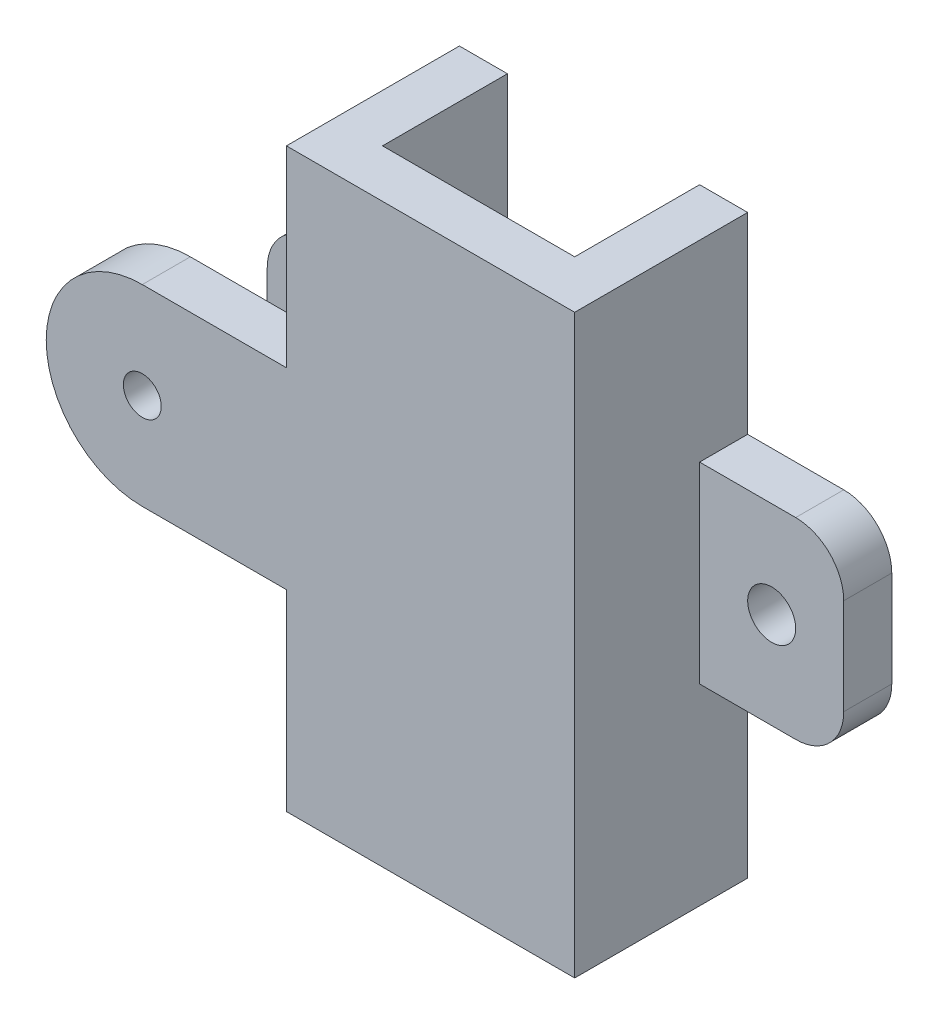
ISO-10303-21;
HEADER;
FILE_DESCRIPTION(('STEP AP214'),'2;1');
FILE_NAME('part.step','',(''),(''),'','','');
FILE_SCHEMA(('AUTOMOTIVE_DESIGN { 1 0 10303 214 1 1 1 1 }'));
ENDSEC;
DATA;
#1=APPLICATION_CONTEXT('core data for automotive mechanical design processes');
#2=APPLICATION_PROTOCOL_DEFINITION('international standard','automotive_design',2000,#1);
#3=PRODUCT_CONTEXT('',#1,'mechanical');
#4=PRODUCT('Part','Part','',(#3));
#5=PRODUCT_RELATED_PRODUCT_CATEGORY('part','',(#4));
#6=PRODUCT_DEFINITION_FORMATION('','',#4);
#7=PRODUCT_DEFINITION_CONTEXT('part definition',#1,'design');
#8=PRODUCT_DEFINITION('design','',#6,#7);
#9=PRODUCT_DEFINITION_SHAPE('','',#8);
#10=(LENGTH_UNIT() NAMED_UNIT(*) SI_UNIT(.MILLI.,.METRE.));
#11=(NAMED_UNIT(*) PLANE_ANGLE_UNIT() SI_UNIT($,.RADIAN.));
#12=(NAMED_UNIT(*) SI_UNIT($,.STERADIAN.) SOLID_ANGLE_UNIT());
#13=UNCERTAINTY_MEASURE_WITH_UNIT(LENGTH_MEASURE(1.E-05),#10,'distance_accuracy_value','');
#14=(GEOMETRIC_REPRESENTATION_CONTEXT(3) GLOBAL_UNCERTAINTY_ASSIGNED_CONTEXT((#13)) GLOBAL_UNIT_ASSIGNED_CONTEXT((#10,
#11,#12)) REPRESENTATION_CONTEXT('',''));
#15=CARTESIAN_POINT('',(0.,0.,0.));
#16=DIRECTION('',(0.,0.,1.));
#17=DIRECTION('',(1.,0.,0.));
#18=AXIS2_PLACEMENT_3D('',#15,#16,#17);
#19=CARTESIAN_POINT('',(38.1,76.2,0.));
#20=DIRECTION('',(-1.,0.,0.));
#21=DIRECTION('',(0.,0.,1.));
#22=AXIS2_PLACEMENT_3D('',#19,#20,#21);
#23=PLANE('',#22);
#24=DIRECTION('',(0.,0.,-1.));
#25=VECTOR('',#24,1.);
#26=CARTESIAN_POINT('',(38.1,25.4,-16.51));
#27=LINE('',#26,#25);
#28=CARTESIAN_POINT('',(38.1,25.4,-16.51));
#29=VERTEX_POINT('',#28);
#30=CARTESIAN_POINT('',(38.1,25.4,-22.86));
#31=VERTEX_POINT('',#30);
#32=EDGE_CURVE('E290',#29,#31,#27,.T.);
#33=ORIENTED_EDGE('',*,*,#32,.F.);
#34=DIRECTION('',(0.,1.,0.));
#35=VECTOR('',#34,1.);
#36=CARTESIAN_POINT('',(38.1,50.8,-16.51));
#37=LINE('',#36,#35);
#38=CARTESIAN_POINT('',(38.1,50.8,-16.51));
#39=VERTEX_POINT('',#38);
#40=EDGE_CURVE('E264',#29,#39,#37,.T.);
#41=ORIENTED_EDGE('',*,*,#40,.T.);
#42=DIRECTION('',(0.,0.,-1.));
#43=VECTOR('',#42,1.);
#44=CARTESIAN_POINT('',(38.1,50.8,-16.51));
#45=LINE('',#44,#43);
#46=CARTESIAN_POINT('',(38.1,50.8,-22.86));
#47=VERTEX_POINT('',#46);
#48=EDGE_CURVE('E280',#39,#47,#45,.T.);
#49=ORIENTED_EDGE('',*,*,#48,.T.);
#50=DIRECTION('',(0.,-1.,0.));
#51=VECTOR('',#50,1.);
#52=CARTESIAN_POINT('',(38.1,76.2,-22.86));
#53=LINE('',#52,#51);
#54=CARTESIAN_POINT('',(38.1,76.2,-22.86));
#55=VERTEX_POINT('',#54);
#56=EDGE_CURVE('E393',#55,#47,#53,.T.);
#57=ORIENTED_EDGE('',*,*,#56,.F.);
#58=DIRECTION('',(0.,0.,-1.));
#59=VECTOR('',#58,1.);
#60=CARTESIAN_POINT('',(38.1,76.2,0.));
#61=LINE('',#60,#59);
#62=CARTESIAN_POINT('',(38.1,76.2,0.));
#63=VERTEX_POINT('',#62);
#64=EDGE_CURVE('E365',#63,#55,#61,.T.);
#65=ORIENTED_EDGE('',*,*,#64,.F.);
#66=DIRECTION('',(0.,-1.,0.));
#67=VECTOR('',#66,1.);
#68=CARTESIAN_POINT('',(38.1,76.2,0.));
#69=LINE('',#68,#67);
#70=CARTESIAN_POINT('',(38.1,0.,0.));
#71=VERTEX_POINT('',#70);
#72=EDGE_CURVE('E397',#63,#71,#69,.T.);
#73=ORIENTED_EDGE('',*,*,#72,.T.);
#74=DIRECTION('',(0.,0.,-1.));
#75=VECTOR('',#74,1.);
#76=CARTESIAN_POINT('',(38.1,0.,0.));
#77=LINE('',#76,#75);
#78=CARTESIAN_POINT('',(38.1,0.,-22.86));
#79=VERTEX_POINT('',#78);
#80=EDGE_CURVE('E346',#71,#79,#77,.T.);
#81=ORIENTED_EDGE('',*,*,#80,.T.);
#82=EDGE_CURVE('E368',#31,#79,#53,.T.);
#83=ORIENTED_EDGE('',*,*,#82,.F.);
#84=EDGE_LOOP('',(#33,#41,#49,#57,#65,#73,#81,#83));
#85=FACE_BOUND('',#84,.T.);
#86=ADVANCED_FACE('F41',(#85),#23,.F.);
#87=CARTESIAN_POINT('',(0.,76.2,-22.86));
#88=DIRECTION('',(0.,0.,-1.));
#89=DIRECTION('',(-1.,0.,0.));
#90=AXIS2_PLACEMENT_3D('',#87,#88,#89);
#91=PLANE('',#90);
#92=DIRECTION('',(0.,-1.,0.));
#93=VECTOR('',#92,1.);
#94=CARTESIAN_POINT('',(57.15,50.8,-22.86));
#95=LINE('',#94,#93);
#96=CARTESIAN_POINT('',(57.15,44.45,-22.86));
#97=VERTEX_POINT('',#96);
#98=CARTESIAN_POINT('',(57.15,31.75,-22.86));
#99=VERTEX_POINT('',#98);
#100=EDGE_CURVE('E284',#97,#99,#95,.T.);
#101=ORIENTED_EDGE('',*,*,#100,.T.);
#102=CARTESIAN_POINT('',(50.8,31.75,-22.86));
#103=DIRECTION('',(0.,0.,-1.));
#104=DIRECTION('',(-1.,0.,0.));
#105=AXIS2_PLACEMENT_3D('',#102,#103,#104);
#106=CIRCLE('',#105,6.35);
#107=CARTESIAN_POINT('',(50.8,25.4,-22.86));
#108=VERTEX_POINT('',#107);
#109=EDGE_CURVE('E432',#99,#108,#106,.T.);
#110=ORIENTED_EDGE('',*,*,#109,.T.);
#111=DIRECTION('',(-1.,0.,0.));
#112=VECTOR('',#111,1.);
#113=CARTESIAN_POINT('',(38.1,25.4,-22.86));
#114=LINE('',#113,#112);
#115=EDGE_CURVE('E269',#108,#31,#114,.T.);
#116=ORIENTED_EDGE('',*,*,#115,.T.);
#117=ORIENTED_EDGE('',*,*,#82,.T.);
#118=DIRECTION('',(1.,0.,0.));
#119=VECTOR('',#118,1.);
#120=CARTESIAN_POINT('',(0.,0.,-22.86));
#121=LINE('',#120,#119);
#122=CARTESIAN_POINT('',(31.75,0.,-22.86));
#123=VERTEX_POINT('',#122);
#124=EDGE_CURVE('E340',#123,#79,#121,.T.);
#125=ORIENTED_EDGE('',*,*,#124,.F.);
#126=DIRECTION('',(0.,-1.,0.));
#127=VECTOR('',#126,1.);
#128=CARTESIAN_POINT('',(31.75,76.2,-22.86));
#129=LINE('',#128,#127);
#130=CARTESIAN_POINT('',(31.75,76.2,-22.86));
#131=VERTEX_POINT('',#130);
#132=EDGE_CURVE('E416',#131,#123,#129,.T.);
#133=ORIENTED_EDGE('',*,*,#132,.F.);
#134=DIRECTION('',(1.,0.,0.));
#135=VECTOR('',#134,1.);
#136=CARTESIAN_POINT('',(0.,76.2,-22.86));
#137=LINE('',#136,#135);
#138=EDGE_CURVE('E341',#131,#55,#137,.T.);
#139=ORIENTED_EDGE('',*,*,#138,.T.);
#140=ORIENTED_EDGE('',*,*,#56,.T.);
#141=DIRECTION('',(1.,0.,0.));
#142=VECTOR('',#141,1.);
#143=CARTESIAN_POINT('',(38.1,50.8,-22.86));
#144=LINE('',#143,#142);
#145=CARTESIAN_POINT('',(50.8,50.8,-22.86));
#146=VERTEX_POINT('',#145);
#147=EDGE_CURVE('E260',#47,#146,#144,.T.);
#148=ORIENTED_EDGE('',*,*,#147,.T.);
#149=CARTESIAN_POINT('',(50.8,44.45,-22.86));
#150=DIRECTION('',(0.,0.,-1.));
#151=DIRECTION('',(-1.,0.,0.));
#152=AXIS2_PLACEMENT_3D('',#149,#150,#151);
#153=CIRCLE('',#152,6.35);
#154=EDGE_CURVE('E429',#146,#97,#153,.T.);
#155=ORIENTED_EDGE('',*,*,#154,.T.);
#156=EDGE_LOOP('',(#101,#110,#116,#117,#125,#133,#139,#140,#148,#155));
#157=FACE_BOUND('',#156,.T.);
#158=CARTESIAN_POINT('',(47.625,38.1,-22.86));
#159=DIRECTION('',(0.,0.,-1.));
#160=DIRECTION('',(-1.,0.,0.));
#161=AXIS2_PLACEMENT_3D('',#158,#159,#160);
#162=CIRCLE('',#161,3.175);
#163=CARTESIAN_POINT('',(44.45,38.1,-22.86));
#164=VERTEX_POINT('',#163);
#165=EDGE_CURVE('E254',#164,#164,#162,.T.);
#166=ORIENTED_EDGE('',*,*,#165,.F.);
#167=EDGE_LOOP('',(#166));
#168=FACE_BOUND('',#167,.T.);
#169=ADVANCED_FACE('F540',(#157,#168),#91,.T.);
#170=CARTESIAN_POINT('',(31.75,76.2,0.));
#171=DIRECTION('',(1.,0.,0.));
#172=DIRECTION('',(0.,0.,-1.));
#173=AXIS2_PLACEMENT_3D('',#170,#171,#172);
#174=PLANE('',#173);
#175=DIRECTION('',(0.,0.,1.));
#176=VECTOR('',#175,1.);
#177=CARTESIAN_POINT('',(31.75,0.,0.));
#178=LINE('',#177,#176);
#179=CARTESIAN_POINT('',(31.75,0.,-6.35));
#180=VERTEX_POINT('',#179);
#181=EDGE_CURVE('E372',#123,#180,#178,.T.);
#182=ORIENTED_EDGE('',*,*,#181,.T.);
#183=DIRECTION('',(0.,-1.,0.));
#184=VECTOR('',#183,1.);
#185=CARTESIAN_POINT('',(31.75,76.2,-6.35));
#186=LINE('',#185,#184);
#187=CARTESIAN_POINT('',(31.75,76.2,-6.35));
#188=VERTEX_POINT('',#187);
#189=EDGE_CURVE('E413',#188,#180,#186,.T.);
#190=ORIENTED_EDGE('',*,*,#189,.F.);
#191=DIRECTION('',(0.,0.,1.));
#192=VECTOR('',#191,1.);
#193=CARTESIAN_POINT('',(31.75,76.2,0.));
#194=LINE('',#193,#192);
#195=EDGE_CURVE('E345',#131,#188,#194,.T.);
#196=ORIENTED_EDGE('',*,*,#195,.F.);
#197=ORIENTED_EDGE('',*,*,#132,.T.);
#198=EDGE_LOOP('',(#182,#190,#196,#197));
#199=FACE_BOUND('',#198,.T.);
#200=ADVANCED_FACE('F545',(#199),#174,.F.);
#201=CARTESIAN_POINT('',(0.,76.2,-6.35));
#202=DIRECTION('',(0.,0.,-1.));
#203=DIRECTION('',(-1.,0.,0.));
#204=AXIS2_PLACEMENT_3D('',#201,#202,#203);
#205=PLANE('',#204);
#206=ORIENTED_EDGE('',*,*,#189,.T.);
#207=DIRECTION('',(1.,0.,0.));
#208=VECTOR('',#207,1.);
#209=CARTESIAN_POINT('',(0.,0.,-6.35));
#210=LINE('',#209,#208);
#211=CARTESIAN_POINT('',(6.35,0.,-6.35));
#212=VERTEX_POINT('',#211);
#213=EDGE_CURVE('E376',#212,#180,#210,.T.);
#214=ORIENTED_EDGE('',*,*,#213,.F.);
#215=DIRECTION('',(0.,-1.,0.));
#216=VECTOR('',#215,1.);
#217=CARTESIAN_POINT('',(6.35,76.2,-6.35));
#218=LINE('',#217,#216);
#219=CARTESIAN_POINT('',(6.35,76.2,-6.35));
#220=VERTEX_POINT('',#219);
#221=EDGE_CURVE('E410',#220,#212,#218,.T.);
#222=ORIENTED_EDGE('',*,*,#221,.F.);
#223=DIRECTION('',(1.,0.,0.));
#224=VECTOR('',#223,1.);
#225=CARTESIAN_POINT('',(0.,76.2,-6.35));
#226=LINE('',#225,#224);
#227=EDGE_CURVE('E350',#220,#188,#226,.T.);
#228=ORIENTED_EDGE('',*,*,#227,.T.);
#229=EDGE_LOOP('',(#206,#214,#222,#228));
#230=FACE_BOUND('',#229,.T.);
#231=ADVANCED_FACE('F558',(#230),#205,.T.);
#232=CARTESIAN_POINT('',(6.35000000000001,76.2,0.));
#233=DIRECTION('',(1.,0.,0.));
#234=DIRECTION('',(0.,0.,-1.));
#235=AXIS2_PLACEMENT_3D('',#232,#233,#234);
#236=PLANE('',#235);
#237=DIRECTION('',(0.,0.,1.));
#238=VECTOR('',#237,1.);
#239=CARTESIAN_POINT('',(6.35000000000001,0.,0.));
#240=LINE('',#239,#238);
#241=CARTESIAN_POINT('',(6.34999999999998,0.,-22.86));
#242=VERTEX_POINT('',#241);
#243=EDGE_CURVE('E380',#242,#212,#240,.T.);
#244=ORIENTED_EDGE('',*,*,#243,.F.);
#245=DIRECTION('',(0.,-1.,0.));
#246=VECTOR('',#245,1.);
#247=CARTESIAN_POINT('',(6.34999999999998,76.2,-22.86));
#248=LINE('',#247,#246);
#249=CARTESIAN_POINT('',(6.34999999999998,76.2,-22.86));
#250=VERTEX_POINT('',#249);
#251=EDGE_CURVE('E407',#250,#242,#248,.T.);
#252=ORIENTED_EDGE('',*,*,#251,.F.);
#253=DIRECTION('',(0.,0.,1.));
#254=VECTOR('',#253,1.);
#255=CARTESIAN_POINT('',(6.35000000000001,76.2,0.));
#256=LINE('',#255,#254);
#257=EDGE_CURVE('E354',#250,#220,#256,.T.);
#258=ORIENTED_EDGE('',*,*,#257,.T.);
#259=ORIENTED_EDGE('',*,*,#221,.T.);
#260=EDGE_LOOP('',(#244,#252,#258,#259));
#261=FACE_BOUND('',#260,.T.);
#262=ADVANCED_FACE('F555',(#261),#236,.T.);
#263=DIRECTION('',(-1.,0.,0.));
#264=VECTOR('',#263,1.);
#265=CARTESIAN_POINT('',(0.,25.4,-22.86));
#266=LINE('',#265,#264);
#267=CARTESIAN_POINT('',(0.,25.4,-22.86));
#268=VERTEX_POINT('',#267);
#269=CARTESIAN_POINT('',(-12.7,25.4,-22.86));
#270=VERTEX_POINT('',#269);
#271=EDGE_CURVE('E208',#268,#270,#266,.T.);
#272=ORIENTED_EDGE('',*,*,#271,.T.);
#273=CARTESIAN_POINT('',(-12.7,31.75,-22.86));
#274=DIRECTION('',(0.,0.,-1.));
#275=DIRECTION('',(-1.,0.,0.));
#276=AXIS2_PLACEMENT_3D('',#273,#274,#275);
#277=CIRCLE('',#276,6.35);
#278=CARTESIAN_POINT('',(-19.05,31.75,-22.86));
#279=VERTEX_POINT('',#278);
#280=EDGE_CURVE('E453',#270,#279,#277,.T.);
#281=ORIENTED_EDGE('',*,*,#280,.T.);
#282=DIRECTION('',(0.,1.,0.));
#283=VECTOR('',#282,1.);
#284=CARTESIAN_POINT('',(-19.05,50.8,-22.86));
#285=LINE('',#284,#283);
#286=CARTESIAN_POINT('',(-19.05,44.45,-22.86));
#287=VERTEX_POINT('',#286);
#288=EDGE_CURVE('E236',#279,#287,#285,.T.);
#289=ORIENTED_EDGE('',*,*,#288,.T.);
#290=CARTESIAN_POINT('',(-12.7,44.45,-22.86));
#291=DIRECTION('',(0.,0.,-1.));
#292=DIRECTION('',(-1.,0.,0.));
#293=AXIS2_PLACEMENT_3D('',#290,#291,#292);
#294=CIRCLE('',#293,6.35);
#295=CARTESIAN_POINT('',(-12.7,50.8,-22.86));
#296=VERTEX_POINT('',#295);
#297=EDGE_CURVE('E450',#287,#296,#294,.T.);
#298=ORIENTED_EDGE('',*,*,#297,.T.);
#299=DIRECTION('',(1.,0.,0.));
#300=VECTOR('',#299,1.);
#301=CARTESIAN_POINT('',(0.,50.8,-22.86));
#302=LINE('',#301,#300);
#303=CARTESIAN_POINT('',(0.,50.8,-22.86));
#304=VERTEX_POINT('',#303);
#305=EDGE_CURVE('E242',#296,#304,#302,.T.);
#306=ORIENTED_EDGE('',*,*,#305,.T.);
#307=DIRECTION('',(0.,-1.,0.));
#308=VECTOR('',#307,1.);
#309=CARTESIAN_POINT('',(0.,76.2,-22.86));
#310=LINE('',#309,#308);
#311=CARTESIAN_POINT('',(0.,76.2,-22.86));
#312=VERTEX_POINT('',#311);
#313=EDGE_CURVE('E215',#312,#304,#310,.T.);
#314=ORIENTED_EDGE('',*,*,#313,.F.);
#315=EDGE_CURVE('E347',#312,#250,#137,.T.);
#316=ORIENTED_EDGE('',*,*,#315,.T.);
#317=ORIENTED_EDGE('',*,*,#251,.T.);
#318=CARTESIAN_POINT('',(0.,0.,-22.86));
#319=VERTEX_POINT('',#318);
#320=EDGE_CURVE('E210',#319,#242,#121,.T.);
#321=ORIENTED_EDGE('',*,*,#320,.F.);
#322=EDGE_CURVE('E203',#268,#319,#310,.T.);
#323=ORIENTED_EDGE('',*,*,#322,.F.);
#324=EDGE_LOOP('',(#272,#281,#289,#298,#306,#314,#316,#317,#321,#323));
#325=FACE_BOUND('',#324,.T.);
#326=CARTESIAN_POINT('',(-9.52500000000001,38.1,-22.86));
#327=DIRECTION('',(0.,0.,-1.));
#328=DIRECTION('',(1.,0.,0.));
#329=AXIS2_PLACEMENT_3D('',#326,#327,#328);
#330=CIRCLE('',#329,3.175);
#331=CARTESIAN_POINT('',(-6.35000000000001,38.1,-22.86));
#332=VERTEX_POINT('',#331);
#333=EDGE_CURVE('E245',#332,#332,#330,.T.);
#334=ORIENTED_EDGE('',*,*,#333,.F.);
#335=EDGE_LOOP('',(#334));
#336=FACE_BOUND('',#335,.T.);
#337=ADVANCED_FACE('F205',(#325,#336),#91,.T.);
#338=CARTESIAN_POINT('',(0.,76.2,0.));
#339=DIRECTION('',(-1.,0.,0.));
#340=DIRECTION('',(0.,0.,1.));
#341=AXIS2_PLACEMENT_3D('',#338,#339,#340);
#342=PLANE('',#341);
#343=DIRECTION('',(0.,0.,-1.));
#344=VECTOR('',#343,1.);
#345=CARTESIAN_POINT('',(0.,50.8,-16.51));
#346=LINE('',#345,#344);
#347=CARTESIAN_POINT('',(0.,50.8,-16.51));
#348=VERTEX_POINT('',#347);
#349=EDGE_CURVE('E228',#348,#304,#346,.T.);
#350=ORIENTED_EDGE('',*,*,#349,.F.);
#351=DIRECTION('',(0.,-1.,0.));
#352=VECTOR('',#351,1.);
#353=CARTESIAN_POINT('',(0.,50.8,-16.51));
#354=LINE('',#353,#352);
#355=CARTESIAN_POINT('',(0.,25.4,-16.51));
#356=VERTEX_POINT('',#355);
#357=EDGE_CURVE('E223',#348,#356,#354,.T.);
#358=ORIENTED_EDGE('',*,*,#357,.T.);
#359=DIRECTION('',(0.,0.,-1.));
#360=VECTOR('',#359,1.);
#361=CARTESIAN_POINT('',(0.,25.4,-16.51));
#362=LINE('',#361,#360);
#363=EDGE_CURVE('E219',#356,#268,#362,.T.);
#364=ORIENTED_EDGE('',*,*,#363,.T.);
#365=ORIENTED_EDGE('',*,*,#322,.T.);
#366=DIRECTION('',(0.,0.,-1.));
#367=VECTOR('',#366,1.);
#368=CARTESIAN_POINT('',(0.,0.,0.));
#369=LINE('',#368,#367);
#370=CARTESIAN_POINT('',(0.,0.,0.));
#371=VERTEX_POINT('',#370);
#372=EDGE_CURVE('E384',#371,#319,#369,.T.);
#373=ORIENTED_EDGE('',*,*,#372,.F.);
#374=DIRECTION('',(0.,-1.,0.));
#375=VECTOR('',#374,1.);
#376=CARTESIAN_POINT('',(0.,76.2,0.));
#377=LINE('',#376,#375);
#378=CARTESIAN_POINT('',(0.,25.4,0.));
#379=VERTEX_POINT('',#378);
#380=EDGE_CURVE('E401',#379,#371,#377,.T.);
#381=ORIENTED_EDGE('',*,*,#380,.F.);
#382=DIRECTION('',(0.,0.,1.));
#383=VECTOR('',#382,1.);
#384=CARTESIAN_POINT('',(0.,25.4,0.));
#385=LINE('',#384,#383);
#386=CARTESIAN_POINT('',(0.,25.4,-6.35));
#387=VERTEX_POINT('',#386);
#388=EDGE_CURVE('E336',#387,#379,#385,.T.);
#389=ORIENTED_EDGE('',*,*,#388,.F.);
#390=DIRECTION('',(0.,-1.,0.));
#391=VECTOR('',#390,1.);
#392=CARTESIAN_POINT('',(0.,76.2,-6.35));
#393=LINE('',#392,#391);
#394=CARTESIAN_POINT('',(0.,50.8,-6.35));
#395=VERTEX_POINT('',#394);
#396=EDGE_CURVE('E419',#395,#387,#393,.T.);
#397=ORIENTED_EDGE('',*,*,#396,.F.);
#398=DIRECTION('',(0.,0.,-1.));
#399=VECTOR('',#398,1.);
#400=CARTESIAN_POINT('',(0.,50.8,0.));
#401=LINE('',#400,#399);
#402=CARTESIAN_POINT('',(0.,50.8,0.));
#403=VERTEX_POINT('',#402);
#404=EDGE_CURVE('E330',#403,#395,#401,.T.);
#405=ORIENTED_EDGE('',*,*,#404,.F.);
#406=CARTESIAN_POINT('',(0.,76.2,0.));
#407=VERTEX_POINT('',#406);
#408=EDGE_CURVE('E216',#407,#403,#377,.T.);
#409=ORIENTED_EDGE('',*,*,#408,.F.);
#410=DIRECTION('',(0.,0.,-1.));
#411=VECTOR('',#410,1.);
#412=CARTESIAN_POINT('',(0.,76.2,0.));
#413=LINE('',#412,#411);
#414=EDGE_CURVE('E358',#407,#312,#413,.T.);
#415=ORIENTED_EDGE('',*,*,#414,.T.);
#416=ORIENTED_EDGE('',*,*,#313,.T.);
#417=EDGE_LOOP('',(#350,#358,#364,#365,#373,#381,#389,#397,#405,#409,#415,#416));
#418=FACE_BOUND('',#417,.T.);
#419=ADVANCED_FACE('F221',(#418),#342,.T.);
#420=CARTESIAN_POINT('',(0.,76.2,0.));
#421=DIRECTION('',(0.,0.,-1.));
#422=DIRECTION('',(-1.,0.,0.));
#423=AXIS2_PLACEMENT_3D('',#420,#421,#422);
#424=PLANE('',#423);
#425=ORIENTED_EDGE('',*,*,#408,.T.);
#426=DIRECTION('',(-1.,0.,0.));
#427=VECTOR('',#426,1.);
#428=CARTESIAN_POINT('',(19.05,50.8,0.));
#429=LINE('',#428,#427);
#430=CARTESIAN_POINT('',(-19.05,50.8,0.));
#431=VERTEX_POINT('',#430);
#432=EDGE_CURVE('E302',#403,#431,#429,.T.);
#433=ORIENTED_EDGE('',*,*,#432,.T.);
#434=CARTESIAN_POINT('',(-19.05,38.1,0.));
#435=DIRECTION('',(0.,0.,1.));
#436=DIRECTION('',(1.,0.,0.));
#437=AXIS2_PLACEMENT_3D('',#434,#435,#436);
#438=CIRCLE('',#437,12.7);
#439=CARTESIAN_POINT('',(-19.05,25.4,0.));
#440=VERTEX_POINT('',#439);
#441=EDGE_CURVE('E321',#431,#440,#438,.T.);
#442=ORIENTED_EDGE('',*,*,#441,.T.);
#443=DIRECTION('',(1.,0.,0.));
#444=VECTOR('',#443,1.);
#445=CARTESIAN_POINT('',(-19.05,25.4,0.));
#446=LINE('',#445,#444);
#447=EDGE_CURVE('E310',#440,#379,#446,.T.);
#448=ORIENTED_EDGE('',*,*,#447,.T.);
#449=ORIENTED_EDGE('',*,*,#380,.T.);
#450=DIRECTION('',(1.,0.,0.));
#451=VECTOR('',#450,1.);
#452=CARTESIAN_POINT('',(0.,0.,0.));
#453=LINE('',#452,#451);
#454=EDGE_CURVE('E387',#371,#71,#453,.T.);
#455=ORIENTED_EDGE('',*,*,#454,.T.);
#456=ORIENTED_EDGE('',*,*,#72,.F.);
#457=DIRECTION('',(1.,0.,0.));
#458=VECTOR('',#457,1.);
#459=CARTESIAN_POINT('',(0.,76.2,0.));
#460=LINE('',#459,#458);
#461=EDGE_CURVE('E362',#407,#63,#460,.T.);
#462=ORIENTED_EDGE('',*,*,#461,.F.);
#463=EDGE_LOOP('',(#425,#433,#442,#448,#449,#455,#456,#462));
#464=FACE_BOUND('',#463,.T.);
#465=CARTESIAN_POINT('',(-19.05,38.1,0.));
#466=DIRECTION('',(0.,0.,1.));
#467=DIRECTION('',(1.,0.,0.));
#468=AXIS2_PLACEMENT_3D('',#465,#466,#467);
#469=CIRCLE('',#468,2.5019);
#470=CARTESIAN_POINT('',(-16.5481,38.1,0.));
#471=VERTEX_POINT('',#470);
#472=EDGE_CURVE('E294',#471,#471,#469,.T.);
#473=ORIENTED_EDGE('',*,*,#472,.F.);
#474=EDGE_LOOP('',(#473));
#475=FACE_BOUND('',#474,.T.);
#476=ADVANCED_FACE('F493',(#464,#475),#424,.F.);
#477=CARTESIAN_POINT('',(0.,76.2,0.));
#478=DIRECTION('',(0.,1.,0.));
#479=DIRECTION('',(0.,0.,1.));
#480=AXIS2_PLACEMENT_3D('',#477,#478,#479);
#481=PLANE('',#480);
#482=ORIENTED_EDGE('',*,*,#138,.F.);
#483=ORIENTED_EDGE('',*,*,#195,.T.);
#484=ORIENTED_EDGE('',*,*,#227,.F.);
#485=ORIENTED_EDGE('',*,*,#257,.F.);
#486=ORIENTED_EDGE('',*,*,#315,.F.);
#487=ORIENTED_EDGE('',*,*,#414,.F.);
#488=ORIENTED_EDGE('',*,*,#461,.T.);
#489=ORIENTED_EDGE('',*,*,#64,.T.);
#490=EDGE_LOOP('',(#482,#483,#484,#485,#486,#487,#488,#489));
#491=FACE_BOUND('',#490,.T.);
#492=ADVANCED_FACE('F513',(#491),#481,.T.);
#493=CARTESIAN_POINT('',(0.,0.,0.));
#494=DIRECTION('',(0.,1.,0.));
#495=DIRECTION('',(0.,0.,1.));
#496=AXIS2_PLACEMENT_3D('',#493,#494,#495);
#497=PLANE('',#496);
#498=ORIENTED_EDGE('',*,*,#124,.T.);
#499=ORIENTED_EDGE('',*,*,#80,.F.);
#500=ORIENTED_EDGE('',*,*,#454,.F.);
#501=ORIENTED_EDGE('',*,*,#372,.T.);
#502=ORIENTED_EDGE('',*,*,#320,.T.);
#503=ORIENTED_EDGE('',*,*,#243,.T.);
#504=ORIENTED_EDGE('',*,*,#213,.T.);
#505=ORIENTED_EDGE('',*,*,#181,.F.);
#506=EDGE_LOOP('',(#498,#499,#500,#501,#502,#503,#504,#505));
#507=FACE_BOUND('',#506,.T.);
#508=ADVANCED_FACE('F500',(#507),#497,.F.);
#509=CARTESIAN_POINT('',(-19.05,25.4,-6.35));
#510=DIRECTION('',(0.,-1.,0.));
#511=DIRECTION('',(1.,0.,0.));
#512=AXIS2_PLACEMENT_3D('',#509,#510,#511);
#513=PLANE('',#512);
#514=DIRECTION('',(1.,0.,0.));
#515=VECTOR('',#514,1.);
#516=CARTESIAN_POINT('',(-19.05,25.4,-6.35));
#517=LINE('',#516,#515);
#518=CARTESIAN_POINT('',(-19.05,25.4,-6.35));
#519=VERTEX_POINT('',#518);
#520=EDGE_CURVE('E314',#519,#387,#517,.T.);
#521=ORIENTED_EDGE('',*,*,#520,.T.);
#522=ORIENTED_EDGE('',*,*,#388,.T.);
#523=ORIENTED_EDGE('',*,*,#447,.F.);
#524=DIRECTION('',(0.,0.,1.));
#525=VECTOR('',#524,1.);
#526=CARTESIAN_POINT('',(-19.05,25.4,-6.35));
#527=LINE('',#526,#525);
#528=EDGE_CURVE('E327',#519,#440,#527,.T.);
#529=ORIENTED_EDGE('',*,*,#528,.F.);
#530=EDGE_LOOP('',(#521,#522,#523,#529));
#531=FACE_BOUND('',#530,.T.);
#532=ADVANCED_FACE('F529',(#531),#513,.T.);
#533=CARTESIAN_POINT('',(-19.05,38.1,-6.35));
#534=DIRECTION('',(0.,0.,1.));
#535=DIRECTION('',(1.,0.,0.));
#536=AXIS2_PLACEMENT_3D('',#533,#534,#535);
#537=CYLINDRICAL_SURFACE('',#536,12.7);
#538=ORIENTED_EDGE('',*,*,#441,.F.);
#539=DIRECTION('',(0.,0.,1.));
#540=VECTOR('',#539,1.);
#541=CARTESIAN_POINT('',(-19.05,50.8,-6.35));
#542=LINE('',#541,#540);
#543=CARTESIAN_POINT('',(-19.05,50.8,-6.35));
#544=VERTEX_POINT('',#543);
#545=EDGE_CURVE('E318',#544,#431,#542,.T.);
#546=ORIENTED_EDGE('',*,*,#545,.F.);
#547=CARTESIAN_POINT('',(-19.05,38.1,-6.35));
#548=DIRECTION('',(0.,0.,1.));
#549=DIRECTION('',(1.,0.,0.));
#550=AXIS2_PLACEMENT_3D('',#547,#548,#549);
#551=CIRCLE('',#550,12.7);
#552=EDGE_CURVE('E309',#544,#519,#551,.T.);
#553=ORIENTED_EDGE('',*,*,#552,.T.);
#554=ORIENTED_EDGE('',*,*,#528,.T.);
#555=EDGE_LOOP('',(#538,#546,#553,#554));
#556=FACE_BOUND('',#555,.T.);
#557=ADVANCED_FACE('F527',(#556),#537,.T.);
#558=CARTESIAN_POINT('',(19.05,50.8,-6.35));
#559=DIRECTION('',(0.,1.,0.));
#560=DIRECTION('',(-1.,0.,0.));
#561=AXIS2_PLACEMENT_3D('',#558,#559,#560);
#562=PLANE('',#561);
#563=ORIENTED_EDGE('',*,*,#432,.F.);
#564=ORIENTED_EDGE('',*,*,#404,.T.);
#565=DIRECTION('',(-1.,0.,0.));
#566=VECTOR('',#565,1.);
#567=CARTESIAN_POINT('',(19.05,50.8,-6.35));
#568=LINE('',#567,#566);
#569=EDGE_CURVE('E306',#395,#544,#568,.T.);
#570=ORIENTED_EDGE('',*,*,#569,.T.);
#571=ORIENTED_EDGE('',*,*,#545,.T.);
#572=EDGE_LOOP('',(#563,#564,#570,#571));
#573=FACE_BOUND('',#572,.T.);
#574=ADVANCED_FACE('F519',(#573),#562,.T.);
#575=CARTESIAN_POINT('',(19.05,38.1,-6.35));
#576=DIRECTION('',(0.,0.,-1.));
#577=DIRECTION('',(-1.,0.,0.));
#578=AXIS2_PLACEMENT_3D('',#575,#576,#577);
#579=PLANE('',#578);
#580=CARTESIAN_POINT('',(-19.05,38.1,-6.35));
#581=DIRECTION('',(0.,0.,1.));
#582=DIRECTION('',(1.,0.,0.));
#583=AXIS2_PLACEMENT_3D('',#580,#581,#582);
#584=CIRCLE('',#583,2.5019);
#585=CARTESIAN_POINT('',(-16.5481,38.1,-6.35));
#586=VERTEX_POINT('',#585);
#587=EDGE_CURVE('E298',#586,#586,#584,.T.);
#588=ORIENTED_EDGE('',*,*,#587,.T.);
#589=EDGE_LOOP('',(#588));
#590=FACE_BOUND('',#589,.T.);
#591=ORIENTED_EDGE('',*,*,#569,.F.);
#592=ORIENTED_EDGE('',*,*,#396,.T.);
#593=ORIENTED_EDGE('',*,*,#520,.F.);
#594=ORIENTED_EDGE('',*,*,#552,.F.);
#595=EDGE_LOOP('',(#591,#592,#593,#594));
#596=FACE_BOUND('',#595,.T.);
#597=ADVANCED_FACE('F523',(#590,#596),#579,.T.);
#598=CARTESIAN_POINT('',(-19.05,38.1,-6.35));
#599=DIRECTION('',(0.,0.,1.));
#600=DIRECTION('',(1.,0.,0.));
#601=AXIS2_PLACEMENT_3D('',#598,#599,#600);
#602=CYLINDRICAL_SURFACE('',#601,2.5019);
#603=ORIENTED_EDGE('',*,*,#587,.F.);
#604=EDGE_LOOP('',(#603));
#605=FACE_BOUND('',#604,.T.);
#606=ORIENTED_EDGE('',*,*,#472,.T.);
#607=EDGE_LOOP('',(#606));
#608=FACE_BOUND('',#607,.T.);
#609=ADVANCED_FACE('F674',(#605,#608),#602,.F.);
#610=CARTESIAN_POINT('',(38.1,25.4,-16.51));
#611=DIRECTION('',(0.,-1.,0.));
#612=DIRECTION('',(0.,0.,-1.));
#613=AXIS2_PLACEMENT_3D('',#610,#611,#612);
#614=PLANE('',#613);
#615=ORIENTED_EDGE('',*,*,#115,.F.);
#616=DIRECTION('',(0.,0.,-1.));
#617=VECTOR('',#616,1.);
#618=CARTESIAN_POINT('',(50.8,25.4,-16.51));
#619=LINE('',#618,#617);
#620=CARTESIAN_POINT('',(50.8,25.4,-16.51));
#621=VERTEX_POINT('',#620);
#622=EDGE_CURVE('E435',#108,#621,#619,.F.);
#623=ORIENTED_EDGE('',*,*,#622,.T.);
#624=DIRECTION('',(-1.,0.,0.));
#625=VECTOR('',#624,1.);
#626=CARTESIAN_POINT('',(38.1,25.4,-16.51));
#627=LINE('',#626,#625);
#628=EDGE_CURVE('E277',#621,#29,#627,.T.);
#629=ORIENTED_EDGE('',*,*,#628,.T.);
#630=ORIENTED_EDGE('',*,*,#32,.T.);
#631=EDGE_LOOP('',(#615,#623,#629,#630));
#632=FACE_BOUND('',#631,.T.);
#633=ADVANCED_FACE('F664',(#632),#614,.T.);
#634=CARTESIAN_POINT('',(57.15,50.8,-16.51));
#635=DIRECTION('',(1.,0.,0.));
#636=DIRECTION('',(0.,0.,-1.));
#637=AXIS2_PLACEMENT_3D('',#634,#635,#636);
#638=PLANE('',#637);
#639=DIRECTION('',(0.,-1.,0.));
#640=VECTOR('',#639,1.);
#641=CARTESIAN_POINT('',(57.15,50.8,-16.51));
#642=LINE('',#641,#640);
#643=CARTESIAN_POINT('',(57.15,44.45,-16.51));
#644=VERTEX_POINT('',#643);
#645=CARTESIAN_POINT('',(57.15,31.75,-16.51));
#646=VERTEX_POINT('',#645);
#647=EDGE_CURVE('E273',#644,#646,#642,.T.);
#648=ORIENTED_EDGE('',*,*,#647,.T.);
#649=DIRECTION('',(0.,0.,-1.));
#650=VECTOR('',#649,1.);
#651=CARTESIAN_POINT('',(57.15,31.75,-16.51));
#652=LINE('',#651,#650);
#653=EDGE_CURVE('E425',#646,#99,#652,.T.);
#654=ORIENTED_EDGE('',*,*,#653,.T.);
#655=ORIENTED_EDGE('',*,*,#100,.F.);
#656=DIRECTION('',(0.,0.,-1.));
#657=VECTOR('',#656,1.);
#658=CARTESIAN_POINT('',(57.15,44.45,-16.51));
#659=LINE('',#658,#657);
#660=EDGE_CURVE('E422',#97,#644,#659,.F.);
#661=ORIENTED_EDGE('',*,*,#660,.T.);
#662=EDGE_LOOP('',(#648,#654,#655,#661));
#663=FACE_BOUND('',#662,.T.);
#664=ADVANCED_FACE('F654',(#663),#638,.T.);
#665=CARTESIAN_POINT('',(38.1,50.8,-16.51));
#666=DIRECTION('',(0.,1.,0.));
#667=DIRECTION('',(0.,0.,1.));
#668=AXIS2_PLACEMENT_3D('',#665,#666,#667);
#669=PLANE('',#668);
#670=DIRECTION('',(1.,0.,0.));
#671=VECTOR('',#670,1.);
#672=CARTESIAN_POINT('',(38.1,50.8,-16.51));
#673=LINE('',#672,#671);
#674=CARTESIAN_POINT('',(50.8,50.8,-16.51));
#675=VERTEX_POINT('',#674);
#676=EDGE_CURVE('E268',#39,#675,#673,.T.);
#677=ORIENTED_EDGE('',*,*,#676,.T.);
#678=DIRECTION('',(0.,0.,-1.));
#679=VECTOR('',#678,1.);
#680=CARTESIAN_POINT('',(50.8,50.8,-16.51));
#681=LINE('',#680,#679);
#682=EDGE_CURVE('E444',#675,#146,#681,.T.);
#683=ORIENTED_EDGE('',*,*,#682,.T.);
#684=ORIENTED_EDGE('',*,*,#147,.F.);
#685=ORIENTED_EDGE('',*,*,#48,.F.);
#686=EDGE_LOOP('',(#677,#683,#684,#685));
#687=FACE_BOUND('',#686,.T.);
#688=ADVANCED_FACE('F644',(#687),#669,.T.);
#689=CARTESIAN_POINT('',(0.,0.,-16.51));
#690=DIRECTION('',(0.,0.,1.));
#691=DIRECTION('',(1.,0.,0.));
#692=AXIS2_PLACEMENT_3D('',#689,#690,#691);
#693=PLANE('',#692);
#694=CARTESIAN_POINT('',(47.625,38.1,-16.51));
#695=DIRECTION('',(0.,0.,-1.));
#696=DIRECTION('',(-1.,0.,0.));
#697=AXIS2_PLACEMENT_3D('',#694,#695,#696);
#698=CIRCLE('',#697,3.175);
#699=CARTESIAN_POINT('',(44.45,38.1,-16.51));
#700=VERTEX_POINT('',#699);
#701=EDGE_CURVE('E256',#700,#700,#698,.T.);
#702=ORIENTED_EDGE('',*,*,#701,.T.);
#703=EDGE_LOOP('',(#702));
#704=FACE_BOUND('',#703,.T.);
#705=ORIENTED_EDGE('',*,*,#628,.F.);
#706=CARTESIAN_POINT('',(50.8,31.75,-16.51));
#707=DIRECTION('',(0.,0.,1.));
#708=DIRECTION('',(1.,0.,0.));
#709=AXIS2_PLACEMENT_3D('',#706,#707,#708);
#710=CIRCLE('',#709,6.35);
#711=EDGE_CURVE('E441',#621,#646,#710,.T.);
#712=ORIENTED_EDGE('',*,*,#711,.T.);
#713=ORIENTED_EDGE('',*,*,#647,.F.);
#714=CARTESIAN_POINT('',(50.8,44.45,-16.51));
#715=DIRECTION('',(0.,0.,1.));
#716=DIRECTION('',(1.,0.,0.));
#717=AXIS2_PLACEMENT_3D('',#714,#715,#716);
#718=CIRCLE('',#717,6.35);
#719=EDGE_CURVE('E438',#644,#675,#718,.T.);
#720=ORIENTED_EDGE('',*,*,#719,.T.);
#721=ORIENTED_EDGE('',*,*,#676,.F.);
#722=ORIENTED_EDGE('',*,*,#40,.F.);
#723=EDGE_LOOP('',(#705,#712,#713,#720,#721,#722));
#724=FACE_BOUND('',#723,.T.);
#725=ADVANCED_FACE('F639',(#704,#724),#693,.T.);
#726=CARTESIAN_POINT('',(47.625,38.1,-16.51));
#727=DIRECTION('',(0.,0.,-1.));
#728=DIRECTION('',(-1.,0.,0.));
#729=AXIS2_PLACEMENT_3D('',#726,#727,#728);
#730=CYLINDRICAL_SURFACE('',#729,3.175);
#731=ORIENTED_EDGE('',*,*,#701,.F.);
#732=EDGE_LOOP('',(#731));
#733=FACE_BOUND('',#732,.T.);
#734=ORIENTED_EDGE('',*,*,#165,.T.);
#735=EDGE_LOOP('',(#734));
#736=FACE_BOUND('',#735,.T.);
#737=ADVANCED_FACE('F632',(#733,#736),#730,.F.);
#738=CARTESIAN_POINT('',(0.,50.8,-16.51));
#739=DIRECTION('',(0.,1.,0.));
#740=DIRECTION('',(0.,0.,1.));
#741=AXIS2_PLACEMENT_3D('',#738,#739,#740);
#742=PLANE('',#741);
#743=ORIENTED_EDGE('',*,*,#305,.F.);
#744=DIRECTION('',(0.,0.,-1.));
#745=VECTOR('',#744,1.);
#746=CARTESIAN_POINT('',(-12.7,50.8,-16.51));
#747=LINE('',#746,#745);
#748=CARTESIAN_POINT('',(-12.7,50.8,-16.51));
#749=VERTEX_POINT('',#748);
#750=EDGE_CURVE('E11',#296,#749,#747,.F.);
#751=ORIENTED_EDGE('',*,*,#750,.T.);
#752=DIRECTION('',(1.,0.,0.));
#753=VECTOR('',#752,1.);
#754=CARTESIAN_POINT('',(0.,50.8,-16.51));
#755=LINE('',#754,#753);
#756=EDGE_CURVE('E229',#749,#348,#755,.T.);
#757=ORIENTED_EDGE('',*,*,#756,.T.);
#758=ORIENTED_EDGE('',*,*,#349,.T.);
#759=EDGE_LOOP('',(#743,#751,#757,#758));
#760=FACE_BOUND('',#759,.T.);
#761=ADVANCED_FACE('F479',(#760),#742,.T.);
#762=CARTESIAN_POINT('',(-19.05,50.8,-16.51));
#763=DIRECTION('',(-1.,0.,0.));
#764=DIRECTION('',(0.,0.,1.));
#765=AXIS2_PLACEMENT_3D('',#762,#763,#764);
#766=PLANE('',#765);
#767=ORIENTED_EDGE('',*,*,#288,.F.);
#768=DIRECTION('',(0.,0.,-1.));
#769=VECTOR('',#768,1.);
#770=CARTESIAN_POINT('',(-19.05,31.75,-16.51));
#771=LINE('',#770,#769);
#772=CARTESIAN_POINT('',(-19.05,31.75,-16.51));
#773=VERTEX_POINT('',#772);
#774=EDGE_CURVE('E460',#279,#773,#771,.F.);
#775=ORIENTED_EDGE('',*,*,#774,.T.);
#776=DIRECTION('',(0.,1.,0.));
#777=VECTOR('',#776,1.);
#778=CARTESIAN_POINT('',(-19.05,50.8,-16.51));
#779=LINE('',#778,#777);
#780=CARTESIAN_POINT('',(-19.05,44.45,-16.51));
#781=VERTEX_POINT('',#780);
#782=EDGE_CURVE('E468',#773,#781,#779,.T.);
#783=ORIENTED_EDGE('',*,*,#782,.T.);
#784=DIRECTION('',(0.,0.,-1.));
#785=VECTOR('',#784,1.);
#786=CARTESIAN_POINT('',(-19.05,44.45,-16.51));
#787=LINE('',#786,#785);
#788=EDGE_CURVE('E456',#781,#287,#787,.T.);
#789=ORIENTED_EDGE('',*,*,#788,.T.);
#790=EDGE_LOOP('',(#767,#775,#783,#789));
#791=FACE_BOUND('',#790,.T.);
#792=ADVANCED_FACE('F476',(#791),#766,.T.);
#793=CARTESIAN_POINT('',(0.,25.4,-16.51));
#794=DIRECTION('',(0.,-1.,0.));
#795=DIRECTION('',(0.,0.,-1.));
#796=AXIS2_PLACEMENT_3D('',#793,#794,#795);
#797=PLANE('',#796);
#798=DIRECTION('',(-1.,0.,0.));
#799=VECTOR('',#798,1.);
#800=CARTESIAN_POINT('',(0.,25.4,-16.51));
#801=LINE('',#800,#799);
#802=CARTESIAN_POINT('',(-12.7,25.4,-16.51));
#803=VERTEX_POINT('',#802);
#804=EDGE_CURVE('E467',#356,#803,#801,.T.);
#805=ORIENTED_EDGE('',*,*,#804,.T.);
#806=DIRECTION('',(0.,0.,-1.));
#807=VECTOR('',#806,1.);
#808=CARTESIAN_POINT('',(-12.7,25.4,-16.51));
#809=LINE('',#808,#807);
#810=EDGE_CURVE('E234',#803,#270,#809,.T.);
#811=ORIENTED_EDGE('',*,*,#810,.T.);
#812=ORIENTED_EDGE('',*,*,#271,.F.);
#813=ORIENTED_EDGE('',*,*,#363,.F.);
#814=EDGE_LOOP('',(#805,#811,#812,#813));
#815=FACE_BOUND('',#814,.T.);
#816=ADVANCED_FACE('F232',(#815),#797,.T.);
#817=CARTESIAN_POINT('',(0.,0.,-16.51));
#818=DIRECTION('',(0.,0.,-1.));
#819=DIRECTION('',(-1.,0.,0.));
#820=AXIS2_PLACEMENT_3D('',#817,#818,#819);
#821=PLANE('',#820);
#822=CARTESIAN_POINT('',(-9.52500000000001,38.1,-16.51));
#823=DIRECTION('',(0.,0.,-1.));
#824=DIRECTION('',(1.,0.,0.));
#825=AXIS2_PLACEMENT_3D('',#822,#823,#824);
#826=CIRCLE('',#825,3.175);
#827=CARTESIAN_POINT('',(-6.35000000000001,38.1,-16.51));
#828=VERTEX_POINT('',#827);
#829=EDGE_CURVE('E237',#828,#828,#826,.T.);
#830=ORIENTED_EDGE('',*,*,#829,.T.);
#831=EDGE_LOOP('',(#830));
#832=FACE_BOUND('',#831,.T.);
#833=ORIENTED_EDGE('',*,*,#782,.F.);
#834=CARTESIAN_POINT('',(-12.7,31.75,-16.51));
#835=DIRECTION('',(0.,0.,-1.));
#836=DIRECTION('',(-1.,0.,0.));
#837=AXIS2_PLACEMENT_3D('',#834,#835,#836);
#838=CIRCLE('',#837,6.35);
#839=EDGE_CURVE('E50',#773,#803,#838,.F.);
#840=ORIENTED_EDGE('',*,*,#839,.T.);
#841=ORIENTED_EDGE('',*,*,#804,.F.);
#842=ORIENTED_EDGE('',*,*,#357,.F.);
#843=ORIENTED_EDGE('',*,*,#756,.F.);
#844=CARTESIAN_POINT('',(-12.7,44.45,-16.51));
#845=DIRECTION('',(0.,0.,-1.));
#846=DIRECTION('',(-1.,0.,0.));
#847=AXIS2_PLACEMENT_3D('',#844,#845,#846);
#848=CIRCLE('',#847,6.35);
#849=EDGE_CURVE('E62',#749,#781,#848,.F.);
#850=ORIENTED_EDGE('',*,*,#849,.T.);
#851=EDGE_LOOP('',(#833,#840,#841,#842,#843,#850));
#852=FACE_BOUND('',#851,.T.);
#853=ADVANCED_FACE('F466',(#832,#852),#821,.F.);
#854=CARTESIAN_POINT('',(-9.52500000000001,38.1,-16.51));
#855=DIRECTION('',(0.,0.,-1.));
#856=DIRECTION('',(-1.,0.,0.));
#857=AXIS2_PLACEMENT_3D('',#854,#855,#856);
#858=CYLINDRICAL_SURFACE('',#857,3.175);
#859=ORIENTED_EDGE('',*,*,#829,.F.);
#860=EDGE_LOOP('',(#859));
#861=FACE_BOUND('',#860,.T.);
#862=ORIENTED_EDGE('',*,*,#333,.T.);
#863=EDGE_LOOP('',(#862));
#864=FACE_BOUND('',#863,.T.);
#865=ADVANCED_FACE('F570',(#861,#864),#858,.F.);
#866=CARTESIAN_POINT('',(50.8,31.75,-16.51));
#867=DIRECTION('',(0.,0.,-1.));
#868=DIRECTION('',(-1.,0.,0.));
#869=AXIS2_PLACEMENT_3D('',#866,#867,#868);
#870=CYLINDRICAL_SURFACE('',#869,6.35);
#871=ORIENTED_EDGE('',*,*,#711,.F.);
#872=ORIENTED_EDGE('',*,*,#622,.F.);
#873=ORIENTED_EDGE('',*,*,#109,.F.);
#874=ORIENTED_EDGE('',*,*,#653,.F.);
#875=EDGE_LOOP('',(#871,#872,#873,#874));
#876=FACE_BOUND('',#875,.T.);
#877=ADVANCED_FACE('F566',(#876),#870,.T.);
#878=CARTESIAN_POINT('',(50.8,44.45,-16.51));
#879=DIRECTION('',(0.,0.,-1.));
#880=DIRECTION('',(-1.,0.,0.));
#881=AXIS2_PLACEMENT_3D('',#878,#879,#880);
#882=CYLINDRICAL_SURFACE('',#881,6.35);
#883=ORIENTED_EDGE('',*,*,#719,.F.);
#884=ORIENTED_EDGE('',*,*,#660,.F.);
#885=ORIENTED_EDGE('',*,*,#154,.F.);
#886=ORIENTED_EDGE('',*,*,#682,.F.);
#887=EDGE_LOOP('',(#883,#884,#885,#886));
#888=FACE_BOUND('',#887,.T.);
#889=ADVANCED_FACE('F569',(#888),#882,.T.);
#890=CARTESIAN_POINT('',(-12.7,31.75,-16.51));
#891=DIRECTION('',(0.,0.,-1.));
#892=DIRECTION('',(-1.,0.,0.));
#893=AXIS2_PLACEMENT_3D('',#890,#891,#892);
#894=CYLINDRICAL_SURFACE('',#893,6.35);
#895=ORIENTED_EDGE('',*,*,#839,.F.);
#896=ORIENTED_EDGE('',*,*,#774,.F.);
#897=ORIENTED_EDGE('',*,*,#280,.F.);
#898=ORIENTED_EDGE('',*,*,#810,.F.);
#899=EDGE_LOOP('',(#895,#896,#897,#898));
#900=FACE_BOUND('',#899,.T.);
#901=ADVANCED_FACE('F473',(#900),#894,.T.);
#902=CARTESIAN_POINT('',(-12.7,44.45,-16.51));
#903=DIRECTION('',(0.,0.,-1.));
#904=DIRECTION('',(-1.,0.,0.));
#905=AXIS2_PLACEMENT_3D('',#902,#903,#904);
#906=CYLINDRICAL_SURFACE('',#905,6.35);
#907=ORIENTED_EDGE('',*,*,#849,.F.);
#908=ORIENTED_EDGE('',*,*,#750,.F.);
#909=ORIENTED_EDGE('',*,*,#297,.F.);
#910=ORIENTED_EDGE('',*,*,#788,.F.);
#911=EDGE_LOOP('',(#907,#908,#909,#910));
#912=FACE_BOUND('',#911,.T.);
#913=ADVANCED_FACE('F43',(#912),#906,.T.);
#914=CLOSED_SHELL('',(#86,#169,#200,#231,#262,#337,#419,#476,#492,#508,#532,#557,#574,#597,#609,
#633,#664,#688,#725,#737,#761,#792,#816,#853,#865,#877,#889,#901,#913));
#915=MANIFOLD_SOLID_BREP('B2',#914);
#916=ADVANCED_BREP_SHAPE_REPRESENTATION('',(#18,#915),#14);
#917=SHAPE_DEFINITION_REPRESENTATION(#9,#916);
ENDSEC;
END-ISO-10303-21;
